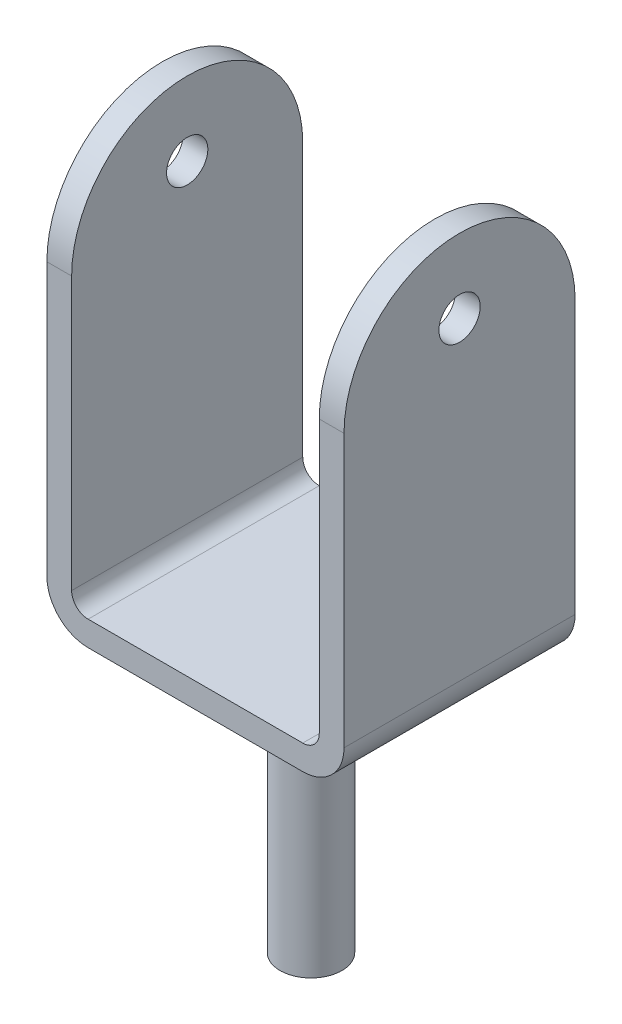
ISO-10303-21;
HEADER;
FILE_DESCRIPTION(('STEP AP214'),'2;1');
FILE_NAME('part.step','',(''),(''),'','','');
FILE_SCHEMA(('AUTOMOTIVE_DESIGN { 1 0 10303 214 1 1 1 1 }'));
ENDSEC;
DATA;
#1=APPLICATION_CONTEXT('core data for automotive mechanical design processes');
#2=APPLICATION_PROTOCOL_DEFINITION('international standard','automotive_design',2000,#1);
#3=PRODUCT_CONTEXT('',#1,'mechanical');
#4=PRODUCT('Part','Part','',(#3));
#5=PRODUCT_RELATED_PRODUCT_CATEGORY('part','',(#4));
#6=PRODUCT_DEFINITION_FORMATION('','',#4);
#7=PRODUCT_DEFINITION_CONTEXT('part definition',#1,'design');
#8=PRODUCT_DEFINITION('design','',#6,#7);
#9=PRODUCT_DEFINITION_SHAPE('','',#8);
#10=(LENGTH_UNIT() NAMED_UNIT(*) SI_UNIT(.MILLI.,.METRE.));
#11=(NAMED_UNIT(*) PLANE_ANGLE_UNIT() SI_UNIT($,.RADIAN.));
#12=(NAMED_UNIT(*) SI_UNIT($,.STERADIAN.) SOLID_ANGLE_UNIT());
#13=UNCERTAINTY_MEASURE_WITH_UNIT(LENGTH_MEASURE(1.E-05),#10,'distance_accuracy_value','');
#14=(GEOMETRIC_REPRESENTATION_CONTEXT(3) GLOBAL_UNCERTAINTY_ASSIGNED_CONTEXT((#13)) GLOBAL_UNIT_ASSIGNED_CONTEXT((#10,
#11,#12)) REPRESENTATION_CONTEXT('',''));
#15=CARTESIAN_POINT('',(0.,0.,0.));
#16=DIRECTION('',(0.,0.,1.));
#17=DIRECTION('',(1.,0.,0.));
#18=AXIS2_PLACEMENT_3D('',#15,#16,#17);
#19=CARTESIAN_POINT('',(-187.5,705.,0.));
#20=DIRECTION('',(1.,0.,0.));
#21=DIRECTION('',(0.,0.,-1.));
#22=AXIS2_PLACEMENT_3D('',#19,#20,#21);
#23=CYLINDRICAL_SURFACE('',#22,140.);
#24=DIRECTION('',(1.,0.,0.));
#25=VECTOR('',#24,1.);
#26=CARTESIAN_POINT('',(0.,705.,140.));
#27=LINE('',#26,#25);
#28=CARTESIAN_POINT('',(-187.5,705.,140.));
#29=VERTEX_POINT('',#28);
#30=CARTESIAN_POINT('',(-217.5,705.,140.));
#31=VERTEX_POINT('',#30);
#32=EDGE_CURVE('E222',#29,#31,#27,.F.);
#33=ORIENTED_EDGE('',*,*,#32,.F.);
#34=CARTESIAN_POINT('',(-187.5,705.,0.));
#35=DIRECTION('',(-1.,0.,0.));
#36=DIRECTION('',(0.,-1.,0.));
#37=AXIS2_PLACEMENT_3D('',#34,#35,#36);
#38=CIRCLE('',#37,140.);
#39=CARTESIAN_POINT('',(-187.5,705.,-140.));
#40=VERTEX_POINT('',#39);
#41=EDGE_CURVE('E45',#40,#29,#38,.F.);
#42=ORIENTED_EDGE('',*,*,#41,.F.);
#43=DIRECTION('',(-1.,0.,0.));
#44=VECTOR('',#43,1.);
#45=CARTESIAN_POINT('',(-187.5,705.,-140.));
#46=LINE('',#45,#44);
#47=CARTESIAN_POINT('',(-217.5,705.,-140.));
#48=VERTEX_POINT('',#47);
#49=EDGE_CURVE('E225',#48,#40,#46,.F.);
#50=ORIENTED_EDGE('',*,*,#49,.F.);
#51=CARTESIAN_POINT('',(-217.5,705.,0.));
#52=DIRECTION('',(-1.,0.,0.));
#53=DIRECTION('',(0.,-1.,0.));
#54=AXIS2_PLACEMENT_3D('',#51,#52,#53);
#55=CIRCLE('',#54,140.);
#56=EDGE_CURVE('E11',#31,#48,#55,.T.);
#57=ORIENTED_EDGE('',*,*,#56,.F.);
#58=EDGE_LOOP('',(#33,#42,#50,#57));
#59=FACE_BOUND('',#58,.T.);
#60=ADVANCED_FACE('F37',(#59),#23,.T.);
#61=CARTESIAN_POINT('',(142.5,705.,0.));
#62=DIRECTION('',(-1.,0.,0.));
#63=DIRECTION('',(0.,0.,1.));
#64=AXIS2_PLACEMENT_3D('',#61,#62,#63);
#65=CYLINDRICAL_SURFACE('',#64,140.);
#66=DIRECTION('',(1.,0.,0.));
#67=VECTOR('',#66,1.);
#68=CARTESIAN_POINT('',(142.5,705.,140.));
#69=LINE('',#68,#67);
#70=CARTESIAN_POINT('',(142.5,705.,140.));
#71=VERTEX_POINT('',#70);
#72=CARTESIAN_POINT('',(112.5,705.,140.));
#73=VERTEX_POINT('',#72);
#74=EDGE_CURVE('E150',#71,#73,#69,.F.);
#75=ORIENTED_EDGE('',*,*,#74,.F.);
#76=CARTESIAN_POINT('',(142.5,705.,0.));
#77=DIRECTION('',(-1.,0.,0.));
#78=DIRECTION('',(0.,-1.,0.));
#79=AXIS2_PLACEMENT_3D('',#76,#77,#78);
#80=CIRCLE('',#79,140.);
#81=CARTESIAN_POINT('',(142.5,705.,-140.));
#82=VERTEX_POINT('',#81);
#83=EDGE_CURVE('E218',#82,#71,#80,.F.);
#84=ORIENTED_EDGE('',*,*,#83,.F.);
#85=DIRECTION('',(-1.,0.,0.));
#86=VECTOR('',#85,1.);
#87=CARTESIAN_POINT('',(0.,705.,-140.));
#88=LINE('',#87,#86);
#89=CARTESIAN_POINT('',(112.5,705.,-140.));
#90=VERTEX_POINT('',#89);
#91=EDGE_CURVE('E215',#90,#82,#88,.F.);
#92=ORIENTED_EDGE('',*,*,#91,.F.);
#93=CARTESIAN_POINT('',(112.5,705.,0.));
#94=DIRECTION('',(-1.,0.,0.));
#95=DIRECTION('',(0.,-1.,0.));
#96=AXIS2_PLACEMENT_3D('',#93,#94,#95);
#97=CIRCLE('',#96,140.);
#98=EDGE_CURVE('E220',#73,#90,#97,.T.);
#99=ORIENTED_EDGE('',*,*,#98,.F.);
#100=EDGE_LOOP('',(#75,#84,#92,#99));
#101=FACE_BOUND('',#100,.T.);
#102=ADVANCED_FACE('F260',(#101),#65,.T.);
#103=CARTESIAN_POINT('',(112.5,0.,140.));
#104=DIRECTION('',(-1.,0.,0.));
#105=DIRECTION('',(0.,-1.,0.));
#106=AXIS2_PLACEMENT_3D('',#103,#104,#105);
#107=PLANE('',#106);
#108=CARTESIAN_POINT('',(112.5,755.572053683915,0.));
#109=DIRECTION('',(-1.,0.,0.));
#110=DIRECTION('',(0.,-1.,0.));
#111=AXIS2_PLACEMENT_3D('',#108,#109,#110);
#112=CIRCLE('',#111,25.);
#113=CARTESIAN_POINT('',(112.5,780.572053683915,0.));
#114=VERTEX_POINT('',#113);
#115=EDGE_CURVE('E289',#114,#114,#112,.T.);
#116=ORIENTED_EDGE('',*,*,#115,.F.);
#117=EDGE_LOOP('',(#116));
#118=FACE_BOUND('',#117,.T.);
#119=DIRECTION('',(0.,1.,0.));
#120=VECTOR('',#119,1.);
#121=CARTESIAN_POINT('',(112.5,0.,140.));
#122=LINE('',#121,#120);
#123=CARTESIAN_POINT('',(112.5,375.,140.));
#124=VERTEX_POINT('',#123);
#125=EDGE_CURVE('E128',#124,#73,#122,.T.);
#126=ORIENTED_EDGE('',*,*,#125,.T.);
#127=ORIENTED_EDGE('',*,*,#98,.T.);
#128=DIRECTION('',(0.,1.,0.));
#129=VECTOR('',#128,1.);
#130=CARTESIAN_POINT('',(112.5,0.,-140.));
#131=LINE('',#130,#129);
#132=CARTESIAN_POINT('',(112.5,375.,-140.));
#133=VERTEX_POINT('',#132);
#134=EDGE_CURVE('E130',#133,#90,#131,.T.);
#135=ORIENTED_EDGE('',*,*,#134,.F.);
#136=DIRECTION('',(0.,0.,-1.));
#137=VECTOR('',#136,1.);
#138=CARTESIAN_POINT('',(112.5,375.,140.));
#139=LINE('',#138,#137);
#140=EDGE_CURVE('E124',#124,#133,#139,.T.);
#141=ORIENTED_EDGE('',*,*,#140,.F.);
#142=EDGE_LOOP('',(#126,#127,#135,#141));
#143=FACE_BOUND('',#142,.T.);
#144=ADVANCED_FACE('F126',(#118,#143),#107,.T.);
#145=CARTESIAN_POINT('',(92.5,375.,140.));
#146=DIRECTION('',(0.,0.,-1.));
#147=DIRECTION('',(-1.,0.,0.));
#148=AXIS2_PLACEMENT_3D('',#145,#146,#147);
#149=CYLINDRICAL_SURFACE('',#148,20.);
#150=CARTESIAN_POINT('',(92.5,375.,-140.));
#151=DIRECTION('',(0.,0.,1.));
#152=DIRECTION('',(1.,0.,0.));
#153=AXIS2_PLACEMENT_3D('',#150,#151,#152);
#154=CIRCLE('',#153,20.);
#155=CARTESIAN_POINT('',(92.4999999999999,355.,-140.));
#156=VERTEX_POINT('',#155);
#157=EDGE_CURVE('E178',#133,#156,#154,.F.);
#158=ORIENTED_EDGE('',*,*,#157,.T.);
#159=DIRECTION('',(0.,0.,-1.));
#160=VECTOR('',#159,1.);
#161=CARTESIAN_POINT('',(92.4999999999999,355.,140.));
#162=LINE('',#161,#160);
#163=CARTESIAN_POINT('',(92.4999999999999,355.,140.));
#164=VERTEX_POINT('',#163);
#165=EDGE_CURVE('E135',#164,#156,#162,.T.);
#166=ORIENTED_EDGE('',*,*,#165,.F.);
#167=CARTESIAN_POINT('',(92.5,375.,140.));
#168=DIRECTION('',(0.,0.,1.));
#169=DIRECTION('',(1.,0.,0.));
#170=AXIS2_PLACEMENT_3D('',#167,#168,#169);
#171=CIRCLE('',#170,20.);
#172=EDGE_CURVE('E138',#124,#164,#171,.F.);
#173=ORIENTED_EDGE('',*,*,#172,.F.);
#174=ORIENTED_EDGE('',*,*,#140,.T.);
#175=EDGE_LOOP('',(#158,#166,#173,#174));
#176=FACE_BOUND('',#175,.T.);
#177=ADVANCED_FACE('F139',(#176),#149,.F.);
#178=CARTESIAN_POINT('',(0.,355.,140.));
#179=DIRECTION('',(0.,1.,0.));
#180=DIRECTION('',(-1.,0.,0.));
#181=AXIS2_PLACEMENT_3D('',#178,#179,#180);
#182=PLANE('',#181);
#183=DIRECTION('',(1.,0.,0.));
#184=VECTOR('',#183,1.);
#185=CARTESIAN_POINT('',(0.,355.,-140.));
#186=LINE('',#185,#184);
#187=CARTESIAN_POINT('',(-167.5,355.,-140.));
#188=VERTEX_POINT('',#187);
#189=EDGE_CURVE('E180',#188,#156,#186,.T.);
#190=ORIENTED_EDGE('',*,*,#189,.F.);
#191=DIRECTION('',(0.,0.,-1.));
#192=VECTOR('',#191,1.);
#193=CARTESIAN_POINT('',(-167.5,355.,140.));
#194=LINE('',#193,#192);
#195=CARTESIAN_POINT('',(-167.5,355.,140.));
#196=VERTEX_POINT('',#195);
#197=EDGE_CURVE('E209',#196,#188,#194,.T.);
#198=ORIENTED_EDGE('',*,*,#197,.F.);
#199=DIRECTION('',(1.,0.,0.));
#200=VECTOR('',#199,1.);
#201=CARTESIAN_POINT('',(0.,355.,140.));
#202=LINE('',#201,#200);
#203=EDGE_CURVE('E143',#196,#164,#202,.T.);
#204=ORIENTED_EDGE('',*,*,#203,.T.);
#205=ORIENTED_EDGE('',*,*,#165,.T.);
#206=EDGE_LOOP('',(#190,#198,#204,#205));
#207=FACE_BOUND('',#206,.T.);
#208=ADVANCED_FACE('F262',(#207),#182,.T.);
#209=CARTESIAN_POINT('',(-167.5,375.,140.));
#210=DIRECTION('',(0.,0.,-1.));
#211=DIRECTION('',(-1.,0.,0.));
#212=AXIS2_PLACEMENT_3D('',#209,#210,#211);
#213=CYLINDRICAL_SURFACE('',#212,20.);
#214=CARTESIAN_POINT('',(-167.5,375.,-140.));
#215=DIRECTION('',(0.,0.,1.));
#216=DIRECTION('',(1.,0.,0.));
#217=AXIS2_PLACEMENT_3D('',#214,#215,#216);
#218=CIRCLE('',#217,20.);
#219=CARTESIAN_POINT('',(-187.5,375.,-140.));
#220=VERTEX_POINT('',#219);
#221=EDGE_CURVE('E183',#188,#220,#218,.F.);
#222=ORIENTED_EDGE('',*,*,#221,.T.);
#223=DIRECTION('',(0.,0.,-1.));
#224=VECTOR('',#223,1.);
#225=CARTESIAN_POINT('',(-187.5,375.,140.));
#226=LINE('',#225,#224);
#227=CARTESIAN_POINT('',(-187.5,375.,140.));
#228=VERTEX_POINT('',#227);
#229=EDGE_CURVE('E206',#228,#220,#226,.T.);
#230=ORIENTED_EDGE('',*,*,#229,.F.);
#231=CARTESIAN_POINT('',(-167.5,375.,140.));
#232=DIRECTION('',(0.,0.,1.));
#233=DIRECTION('',(1.,0.,0.));
#234=AXIS2_PLACEMENT_3D('',#231,#232,#233);
#235=CIRCLE('',#234,20.);
#236=EDGE_CURVE('E161',#196,#228,#235,.F.);
#237=ORIENTED_EDGE('',*,*,#236,.F.);
#238=ORIENTED_EDGE('',*,*,#197,.T.);
#239=EDGE_LOOP('',(#222,#230,#237,#238));
#240=FACE_BOUND('',#239,.T.);
#241=ADVANCED_FACE('F234',(#240),#213,.F.);
#242=CARTESIAN_POINT('',(-187.5,0.,140.));
#243=DIRECTION('',(-1.,0.,0.));
#244=DIRECTION('',(0.,-1.,0.));
#245=AXIS2_PLACEMENT_3D('',#242,#243,#244);
#246=PLANE('',#245);
#247=CARTESIAN_POINT('',(-187.5,755.572053683915,0.));
#248=DIRECTION('',(-1.,0.,0.));
#249=DIRECTION('',(0.,-1.,0.));
#250=AXIS2_PLACEMENT_3D('',#247,#248,#249);
#251=CIRCLE('',#250,25.);
#252=CARTESIAN_POINT('',(-187.5,780.572053683915,0.));
#253=VERTEX_POINT('',#252);
#254=EDGE_CURVE('E291',#253,#253,#251,.T.);
#255=ORIENTED_EDGE('',*,*,#254,.T.);
#256=EDGE_LOOP('',(#255));
#257=FACE_BOUND('',#256,.T.);
#258=DIRECTION('',(0.,1.,0.));
#259=VECTOR('',#258,1.);
#260=CARTESIAN_POINT('',(-187.5,0.,-140.));
#261=LINE('',#260,#259);
#262=EDGE_CURVE('E185',#220,#40,#261,.T.);
#263=ORIENTED_EDGE('',*,*,#262,.T.);
#264=ORIENTED_EDGE('',*,*,#41,.T.);
#265=DIRECTION('',(0.,1.,0.));
#266=VECTOR('',#265,1.);
#267=CARTESIAN_POINT('',(-187.5,0.,140.));
#268=LINE('',#267,#266);
#269=EDGE_CURVE('E163',#228,#29,#268,.T.);
#270=ORIENTED_EDGE('',*,*,#269,.F.);
#271=ORIENTED_EDGE('',*,*,#229,.T.);
#272=EDGE_LOOP('',(#263,#264,#270,#271));
#273=FACE_BOUND('',#272,.T.);
#274=ADVANCED_FACE('F228',(#257,#273),#246,.F.);
#275=CARTESIAN_POINT('',(-217.5,0.,140.));
#276=DIRECTION('',(-1.,0.,0.));
#277=DIRECTION('',(0.,-1.,0.));
#278=AXIS2_PLACEMENT_3D('',#275,#276,#277);
#279=PLANE('',#278);
#280=CARTESIAN_POINT('',(-217.5,755.572053683915,0.));
#281=DIRECTION('',(1.,0.,0.));
#282=DIRECTION('',(0.,1.,0.));
#283=AXIS2_PLACEMENT_3D('',#280,#281,#282);
#284=CIRCLE('',#283,25.);
#285=CARTESIAN_POINT('',(-217.5,780.572053683915,0.));
#286=VERTEX_POINT('',#285);
#287=EDGE_CURVE('E294',#286,#286,#284,.T.);
#288=ORIENTED_EDGE('',*,*,#287,.T.);
#289=EDGE_LOOP('',(#288));
#290=FACE_BOUND('',#289,.T.);
#291=DIRECTION('',(0.,1.,0.));
#292=VECTOR('',#291,1.);
#293=CARTESIAN_POINT('',(-217.5,0.,140.));
#294=LINE('',#293,#292);
#295=CARTESIAN_POINT('',(-217.5,375.,140.));
#296=VERTEX_POINT('',#295);
#297=EDGE_CURVE('E165',#296,#31,#294,.T.);
#298=ORIENTED_EDGE('',*,*,#297,.T.);
#299=ORIENTED_EDGE('',*,*,#56,.T.);
#300=DIRECTION('',(0.,1.,0.));
#301=VECTOR('',#300,1.);
#302=CARTESIAN_POINT('',(-217.5,0.,-140.));
#303=LINE('',#302,#301);
#304=CARTESIAN_POINT('',(-217.5,375.,-140.));
#305=VERTEX_POINT('',#304);
#306=EDGE_CURVE('E188',#305,#48,#303,.T.);
#307=ORIENTED_EDGE('',*,*,#306,.F.);
#308=DIRECTION('',(0.,0.,-1.));
#309=VECTOR('',#308,1.);
#310=CARTESIAN_POINT('',(-217.5,375.,140.));
#311=LINE('',#310,#309);
#312=EDGE_CURVE('E204',#296,#305,#311,.T.);
#313=ORIENTED_EDGE('',*,*,#312,.F.);
#314=EDGE_LOOP('',(#298,#299,#307,#313));
#315=FACE_BOUND('',#314,.T.);
#316=ADVANCED_FACE('F241',(#290,#315),#279,.T.);
#317=CARTESIAN_POINT('',(-167.5,375.,140.));
#318=DIRECTION('',(0.,0.,-1.));
#319=DIRECTION('',(-1.,0.,0.));
#320=AXIS2_PLACEMENT_3D('',#317,#318,#319);
#321=CYLINDRICAL_SURFACE('',#320,50.);
#322=CARTESIAN_POINT('',(-167.5,375.,-140.));
#323=DIRECTION('',(0.,0.,1.));
#324=DIRECTION('',(1.,0.,0.));
#325=AXIS2_PLACEMENT_3D('',#322,#323,#324);
#326=CIRCLE('',#325,50.);
#327=CARTESIAN_POINT('',(-167.5,325.,-140.));
#328=VERTEX_POINT('',#327);
#329=EDGE_CURVE('E191',#328,#305,#326,.F.);
#330=ORIENTED_EDGE('',*,*,#329,.F.);
#331=DIRECTION('',(0.,0.,-1.));
#332=VECTOR('',#331,1.);
#333=CARTESIAN_POINT('',(-167.5,325.,140.));
#334=LINE('',#333,#332);
#335=CARTESIAN_POINT('',(-167.5,325.,140.));
#336=VERTEX_POINT('',#335);
#337=EDGE_CURVE('E202',#336,#328,#334,.T.);
#338=ORIENTED_EDGE('',*,*,#337,.F.);
#339=CARTESIAN_POINT('',(-167.5,375.,140.));
#340=DIRECTION('',(0.,0.,1.));
#341=DIRECTION('',(1.,0.,0.));
#342=AXIS2_PLACEMENT_3D('',#339,#340,#341);
#343=CIRCLE('',#342,50.);
#344=EDGE_CURVE('E167',#336,#296,#343,.F.);
#345=ORIENTED_EDGE('',*,*,#344,.T.);
#346=ORIENTED_EDGE('',*,*,#312,.T.);
#347=EDGE_LOOP('',(#330,#338,#345,#346));
#348=FACE_BOUND('',#347,.T.);
#349=ADVANCED_FACE('F244',(#348),#321,.T.);
#350=CARTESIAN_POINT('',(0.,325.,140.));
#351=DIRECTION('',(0.,1.,0.));
#352=DIRECTION('',(-1.,0.,0.));
#353=AXIS2_PLACEMENT_3D('',#350,#351,#352);
#354=PLANE('',#353);
#355=CARTESIAN_POINT('',(-37.5,325.,0.));
#356=DIRECTION('',(0.,1.,0.));
#357=DIRECTION('',(-1.,0.,0.));
#358=AXIS2_PLACEMENT_3D('',#355,#356,#357);
#359=CIRCLE('',#358,37.5);
#360=CARTESIAN_POINT('',(-75.,325.,0.));
#361=VERTEX_POINT('',#360);
#362=EDGE_CURVE('E134',#361,#361,#359,.F.);
#363=ORIENTED_EDGE('',*,*,#362,.F.);
#364=EDGE_LOOP('',(#363));
#365=FACE_BOUND('',#364,.T.);
#366=DIRECTION('',(1.,0.,0.));
#367=VECTOR('',#366,1.);
#368=CARTESIAN_POINT('',(0.,325.,-140.));
#369=LINE('',#368,#367);
#370=CARTESIAN_POINT('',(92.5,325.,-140.));
#371=VERTEX_POINT('',#370);
#372=EDGE_CURVE('E194',#328,#371,#369,.T.);
#373=ORIENTED_EDGE('',*,*,#372,.T.);
#374=DIRECTION('',(0.,0.,-1.));
#375=VECTOR('',#374,1.);
#376=CARTESIAN_POINT('',(92.5,325.,140.));
#377=LINE('',#376,#375);
#378=CARTESIAN_POINT('',(92.5,325.,140.));
#379=VERTEX_POINT('',#378);
#380=EDGE_CURVE('E199',#379,#371,#377,.T.);
#381=ORIENTED_EDGE('',*,*,#380,.F.);
#382=DIRECTION('',(1.,0.,0.));
#383=VECTOR('',#382,1.);
#384=CARTESIAN_POINT('',(0.,325.,140.));
#385=LINE('',#384,#383);
#386=EDGE_CURVE('E170',#336,#379,#385,.T.);
#387=ORIENTED_EDGE('',*,*,#386,.F.);
#388=ORIENTED_EDGE('',*,*,#337,.T.);
#389=EDGE_LOOP('',(#373,#381,#387,#388));
#390=FACE_BOUND('',#389,.T.);
#391=ADVANCED_FACE('F248',(#365,#390),#354,.F.);
#392=CARTESIAN_POINT('',(92.5,375.,140.));
#393=DIRECTION('',(0.,0.,-1.));
#394=DIRECTION('',(-1.,0.,0.));
#395=AXIS2_PLACEMENT_3D('',#392,#393,#394);
#396=CYLINDRICAL_SURFACE('',#395,50.);
#397=CARTESIAN_POINT('',(92.5,375.,-140.));
#398=DIRECTION('',(0.,0.,1.));
#399=DIRECTION('',(1.,0.,0.));
#400=AXIS2_PLACEMENT_3D('',#397,#398,#399);
#401=CIRCLE('',#400,50.);
#402=CARTESIAN_POINT('',(142.5,375.,-140.));
#403=VERTEX_POINT('',#402);
#404=EDGE_CURVE('E154',#371,#403,#401,.T.);
#405=ORIENTED_EDGE('',*,*,#404,.T.);
#406=DIRECTION('',(0.,0.,-1.));
#407=VECTOR('',#406,1.);
#408=CARTESIAN_POINT('',(142.5,375.,140.));
#409=LINE('',#408,#407);
#410=CARTESIAN_POINT('',(142.5,375.,140.));
#411=VERTEX_POINT('',#410);
#412=EDGE_CURVE('E176',#411,#403,#409,.T.);
#413=ORIENTED_EDGE('',*,*,#412,.F.);
#414=CARTESIAN_POINT('',(92.5,375.,140.));
#415=DIRECTION('',(0.,0.,1.));
#416=DIRECTION('',(1.,0.,0.));
#417=AXIS2_PLACEMENT_3D('',#414,#415,#416);
#418=CIRCLE('',#417,50.);
#419=EDGE_CURVE('E172',#379,#411,#418,.T.);
#420=ORIENTED_EDGE('',*,*,#419,.F.);
#421=ORIENTED_EDGE('',*,*,#380,.T.);
#422=EDGE_LOOP('',(#405,#413,#420,#421));
#423=FACE_BOUND('',#422,.T.);
#424=ADVANCED_FACE('F253',(#423),#396,.T.);
#425=CARTESIAN_POINT('',(142.5,0.,140.));
#426=DIRECTION('',(-1.,0.,0.));
#427=DIRECTION('',(0.,-1.,0.));
#428=AXIS2_PLACEMENT_3D('',#425,#426,#427);
#429=PLANE('',#428);
#430=CARTESIAN_POINT('',(142.5,755.572053683915,0.));
#431=DIRECTION('',(1.,0.,0.));
#432=DIRECTION('',(0.,1.,0.));
#433=AXIS2_PLACEMENT_3D('',#430,#431,#432);
#434=CIRCLE('',#433,25.);
#435=CARTESIAN_POINT('',(142.5,780.572053683915,0.));
#436=VERTEX_POINT('',#435);
#437=EDGE_CURVE('E297',#436,#436,#434,.T.);
#438=ORIENTED_EDGE('',*,*,#437,.F.);
#439=EDGE_LOOP('',(#438));
#440=FACE_BOUND('',#439,.T.);
#441=DIRECTION('',(0.,1.,0.));
#442=VECTOR('',#441,1.);
#443=CARTESIAN_POINT('',(142.5,0.,-140.));
#444=LINE('',#443,#442);
#445=EDGE_CURVE('E151',#403,#82,#444,.T.);
#446=ORIENTED_EDGE('',*,*,#445,.T.);
#447=ORIENTED_EDGE('',*,*,#83,.T.);
#448=DIRECTION('',(0.,1.,0.));
#449=VECTOR('',#448,1.);
#450=CARTESIAN_POINT('',(142.5,0.,140.));
#451=LINE('',#450,#449);
#452=EDGE_CURVE('E174',#411,#71,#451,.T.);
#453=ORIENTED_EDGE('',*,*,#452,.F.);
#454=ORIENTED_EDGE('',*,*,#412,.T.);
#455=EDGE_LOOP('',(#446,#447,#453,#454));
#456=FACE_BOUND('',#455,.T.);
#457=ADVANCED_FACE('F257',(#440,#456),#429,.F.);
#458=CARTESIAN_POINT('',(0.,0.,140.));
#459=DIRECTION('',(0.,0.,1.));
#460=DIRECTION('',(1.,0.,0.));
#461=AXIS2_PLACEMENT_3D('',#458,#459,#460);
#462=PLANE('',#461);
#463=ORIENTED_EDGE('',*,*,#269,.T.);
#464=ORIENTED_EDGE('',*,*,#32,.T.);
#465=ORIENTED_EDGE('',*,*,#297,.F.);
#466=ORIENTED_EDGE('',*,*,#344,.F.);
#467=ORIENTED_EDGE('',*,*,#386,.T.);
#468=ORIENTED_EDGE('',*,*,#419,.T.);
#469=ORIENTED_EDGE('',*,*,#452,.T.);
#470=ORIENTED_EDGE('',*,*,#74,.T.);
#471=ORIENTED_EDGE('',*,*,#125,.F.);
#472=ORIENTED_EDGE('',*,*,#172,.T.);
#473=ORIENTED_EDGE('',*,*,#203,.F.);
#474=ORIENTED_EDGE('',*,*,#236,.T.);
#475=EDGE_LOOP('',(#463,#464,#465,#466,#467,#468,#469,#470,#471,#472,#473,#474));
#476=FACE_BOUND('',#475,.T.);
#477=ADVANCED_FACE('F147',(#476),#462,.T.);
#478=CARTESIAN_POINT('',(0.,0.,-140.));
#479=DIRECTION('',(0.,0.,1.));
#480=DIRECTION('',(1.,0.,0.));
#481=AXIS2_PLACEMENT_3D('',#478,#479,#480);
#482=PLANE('',#481);
#483=ORIENTED_EDGE('',*,*,#306,.T.);
#484=ORIENTED_EDGE('',*,*,#49,.T.);
#485=ORIENTED_EDGE('',*,*,#262,.F.);
#486=ORIENTED_EDGE('',*,*,#221,.F.);
#487=ORIENTED_EDGE('',*,*,#189,.T.);
#488=ORIENTED_EDGE('',*,*,#157,.F.);
#489=ORIENTED_EDGE('',*,*,#134,.T.);
#490=ORIENTED_EDGE('',*,*,#91,.T.);
#491=ORIENTED_EDGE('',*,*,#445,.F.);
#492=ORIENTED_EDGE('',*,*,#404,.F.);
#493=ORIENTED_EDGE('',*,*,#372,.F.);
#494=ORIENTED_EDGE('',*,*,#329,.T.);
#495=EDGE_LOOP('',(#483,#484,#485,#486,#487,#488,#489,#490,#491,#492,#493,#494));
#496=FACE_BOUND('',#495,.T.);
#497=ADVANCED_FACE('F237',(#496),#482,.F.);
#498=CARTESIAN_POINT('',(0.,0.,0.));
#499=DIRECTION('',(0.,-1.,0.));
#500=DIRECTION('',(1.,0.,0.));
#501=AXIS2_PLACEMENT_3D('',#498,#499,#500);
#502=PLANE('',#501);
#503=CARTESIAN_POINT('',(-37.5,0.,0.));
#504=DIRECTION('',(0.,1.,0.));
#505=DIRECTION('',(-1.,0.,0.));
#506=AXIS2_PLACEMENT_3D('',#503,#504,#505);
#507=CIRCLE('',#506,37.5);
#508=CARTESIAN_POINT('',(-75.,0.,0.));
#509=VERTEX_POINT('',#508);
#510=EDGE_CURVE('E157',#509,#509,#507,.T.);
#511=ORIENTED_EDGE('',*,*,#510,.F.);
#512=EDGE_LOOP('',(#511));
#513=FACE_BOUND('',#512,.T.);
#514=ADVANCED_FACE('F330',(#513),#502,.T.);
#515=CARTESIAN_POINT('',(-37.5,325.,0.));
#516=DIRECTION('',(0.,1.,0.));
#517=DIRECTION('',(-1.,0.,0.));
#518=AXIS2_PLACEMENT_3D('',#515,#516,#517);
#519=CYLINDRICAL_SURFACE('',#518,37.5);
#520=ORIENTED_EDGE('',*,*,#362,.T.);
#521=EDGE_LOOP('',(#520));
#522=FACE_BOUND('',#521,.T.);
#523=ORIENTED_EDGE('',*,*,#510,.T.);
#524=EDGE_LOOP('',(#523));
#525=FACE_BOUND('',#524,.T.);
#526=ADVANCED_FACE('F335',(#522,#525),#519,.T.);
#527=CARTESIAN_POINT('',(-217.5,755.572053683915,0.));
#528=DIRECTION('',(1.,0.,0.));
#529=DIRECTION('',(0.,1.,0.));
#530=AXIS2_PLACEMENT_3D('',#527,#528,#529);
#531=CYLINDRICAL_SURFACE('',#530,25.);
#532=CARTESIAN_POINT('',(112.5,780.572053683915,0.));
#533=CARTESIAN_POINT('',(112.8125,780.572053683915,0.));
#534=CARTESIAN_POINT('',(113.125,780.572053683915,0.));
#535=CARTESIAN_POINT('',(113.75,780.572053683915,0.));
#536=CARTESIAN_POINT('',(114.0625,780.572053683915,0.));
#537=CARTESIAN_POINT('',(114.6875,780.572053683915,0.));
#538=CARTESIAN_POINT('',(115.,780.572053683915,0.));
#539=CARTESIAN_POINT('',(115.625,780.572053683915,0.));
#540=CARTESIAN_POINT('',(115.9375,780.572053683915,0.));
#541=CARTESIAN_POINT('',(116.5625,780.572053683915,0.));
#542=CARTESIAN_POINT('',(116.875,780.572053683915,0.));
#543=CARTESIAN_POINT('',(117.5,780.572053683915,0.));
#544=CARTESIAN_POINT('',(117.8125,780.572053683915,0.));
#545=CARTESIAN_POINT('',(118.4375,780.572053683915,0.));
#546=CARTESIAN_POINT('',(118.75,780.572053683915,0.));
#547=CARTESIAN_POINT('',(119.375,780.572053683915,0.));
#548=CARTESIAN_POINT('',(119.6875,780.572053683915,0.));
#549=CARTESIAN_POINT('',(120.3125,780.572053683915,0.));
#550=CARTESIAN_POINT('',(120.625,780.572053683915,0.));
#551=CARTESIAN_POINT('',(121.25,780.572053683915,0.));
#552=CARTESIAN_POINT('',(121.5625,780.572053683915,0.));
#553=CARTESIAN_POINT('',(122.1875,780.572053683915,0.));
#554=CARTESIAN_POINT('',(122.5,780.572053683915,0.));
#555=CARTESIAN_POINT('',(123.125,780.572053683915,0.));
#556=CARTESIAN_POINT('',(123.4375,780.572053683915,0.));
#557=CARTESIAN_POINT('',(124.0625,780.572053683915,0.));
#558=CARTESIAN_POINT('',(124.375,780.572053683915,0.));
#559=CARTESIAN_POINT('',(125.,780.572053683915,0.));
#560=CARTESIAN_POINT('',(125.3125,780.572053683915,0.));
#561=CARTESIAN_POINT('',(125.9375,780.572053683915,0.));
#562=CARTESIAN_POINT('',(126.25,780.572053683915,0.));
#563=CARTESIAN_POINT('',(126.875,780.572053683915,0.));
#564=CARTESIAN_POINT('',(127.1875,780.572053683915,0.));
#565=CARTESIAN_POINT('',(127.8125,780.572053683915,0.));
#566=CARTESIAN_POINT('',(128.125,780.572053683915,0.));
#567=CARTESIAN_POINT('',(128.75,780.572053683915,0.));
#568=CARTESIAN_POINT('',(129.0625,780.572053683915,0.));
#569=CARTESIAN_POINT('',(129.6875,780.572053683915,0.));
#570=CARTESIAN_POINT('',(130.,780.572053683915,0.));
#571=CARTESIAN_POINT('',(130.625,780.572053683915,0.));
#572=CARTESIAN_POINT('',(130.9375,780.572053683915,0.));
#573=CARTESIAN_POINT('',(131.5625,780.572053683915,0.));
#574=CARTESIAN_POINT('',(131.875,780.572053683915,0.));
#575=CARTESIAN_POINT('',(132.5,780.572053683915,0.));
#576=CARTESIAN_POINT('',(132.8125,780.572053683915,0.));
#577=CARTESIAN_POINT('',(133.4375,780.572053683915,0.));
#578=CARTESIAN_POINT('',(133.75,780.572053683915,0.));
#579=CARTESIAN_POINT('',(134.375,780.572053683915,0.));
#580=CARTESIAN_POINT('',(134.6875,780.572053683915,0.));
#581=CARTESIAN_POINT('',(135.3125,780.572053683915,0.));
#582=CARTESIAN_POINT('',(135.625,780.572053683915,0.));
#583=CARTESIAN_POINT('',(136.25,780.572053683915,0.));
#584=CARTESIAN_POINT('',(136.5625,780.572053683915,0.));
#585=CARTESIAN_POINT('',(137.1875,780.572053683915,0.));
#586=CARTESIAN_POINT('',(137.5,780.572053683915,0.));
#587=CARTESIAN_POINT('',(138.125,780.572053683915,0.));
#588=CARTESIAN_POINT('',(138.4375,780.572053683915,0.));
#589=CARTESIAN_POINT('',(139.0625,780.572053683915,0.));
#590=CARTESIAN_POINT('',(139.375,780.572053683915,0.));
#591=CARTESIAN_POINT('',(140.,780.572053683915,0.));
#592=CARTESIAN_POINT('',(140.3125,780.572053683915,0.));
#593=CARTESIAN_POINT('',(140.9375,780.572053683915,0.));
#594=CARTESIAN_POINT('',(141.25,780.572053683915,0.));
#595=CARTESIAN_POINT('',(141.875,780.572053683915,0.));
#596=CARTESIAN_POINT('',(142.1875,780.572053683915,0.));
#597=CARTESIAN_POINT('',(142.5,780.572053683915,0.));
#598=B_SPLINE_CURVE_WITH_KNOTS('',3,(#532,#533,#534,#535,#536,#537,#538,#539,#540,#541,#542,
#543,#544,#545,#546,#547,#548,#549,#550,#551,#552,#553,#554,#555,#556,#557,#558,#559,#560,#561,
#562,#563,#564,#565,#566,#567,#568,#569,#570,#571,#572,#573,#574,#575,#576,#577,#578,#579,#580,
#581,#582,#583,#584,#585,#586,#587,#588,#589,#590,#591,#592,#593,#594,#595,#596,#597),
.UNSPECIFIED.,.F.,.F.,(4,2,2,2,2,2,2,2,2,2,2,2,2,2,2,2,2,2,2,2,2,2,2,2,2,2,2,2,2,2,2,2,4),(0.,
0.93749999999998,1.87500000000002,2.8125,3.74999999999998,4.68750000000001,5.62499999999999,
6.56249999999997,7.49999999999995,8.43749999999999,9.37499999999997,10.3124999999999,11.25,
12.1875,13.1249999999999,14.0625,15.,15.9374999999999,16.875,17.8125,18.7499999999999,19.6875,
20.625,21.5624999999999,22.5,23.4374999999999,24.3749999999999,25.3124999999999,
26.2499999999999,27.1874999999999,28.1249999999999,29.0624999999999,29.9999999999999),.UNSPECIFIED.);
#599=EDGE_CURVE('BSEAM307',#114,#436,#598,.T.);
#600=ORIENTED_EDGE('',*,*,#115,.T.);
#601=ORIENTED_EDGE('',*,*,#437,.T.);
#602=ORIENTED_EDGE('',*,*,#599,.T.);
#603=ORIENTED_EDGE('',*,*,#599,.F.);
#604=EDGE_LOOP('',(#600,#602,#601,#603));
#605=FACE_BOUND('',#604,.T.);
#606=ADVANCED_FACE('F307',(#605),#531,.F.);
#607=CARTESIAN_POINT('',(-217.5,780.572053683915,0.));
#608=CARTESIAN_POINT('',(-217.1875,780.572053683915,0.));
#609=CARTESIAN_POINT('',(-216.875,780.572053683915,0.));
#610=CARTESIAN_POINT('',(-216.25,780.572053683915,0.));
#611=CARTESIAN_POINT('',(-215.9375,780.572053683915,0.));
#612=CARTESIAN_POINT('',(-215.3125,780.572053683915,0.));
#613=CARTESIAN_POINT('',(-215.,780.572053683915,0.));
#614=CARTESIAN_POINT('',(-214.375,780.572053683915,0.));
#615=CARTESIAN_POINT('',(-214.0625,780.572053683915,0.));
#616=CARTESIAN_POINT('',(-213.4375,780.572053683915,0.));
#617=CARTESIAN_POINT('',(-213.125,780.572053683915,0.));
#618=CARTESIAN_POINT('',(-212.5,780.572053683915,0.));
#619=CARTESIAN_POINT('',(-212.1875,780.572053683915,0.));
#620=CARTESIAN_POINT('',(-211.5625,780.572053683915,0.));
#621=CARTESIAN_POINT('',(-211.25,780.572053683915,0.));
#622=CARTESIAN_POINT('',(-210.625,780.572053683915,0.));
#623=CARTESIAN_POINT('',(-210.3125,780.572053683915,0.));
#624=CARTESIAN_POINT('',(-209.6875,780.572053683915,0.));
#625=CARTESIAN_POINT('',(-209.375,780.572053683915,0.));
#626=CARTESIAN_POINT('',(-208.75,780.572053683915,0.));
#627=CARTESIAN_POINT('',(-208.4375,780.572053683915,0.));
#628=CARTESIAN_POINT('',(-207.8125,780.572053683915,0.));
#629=CARTESIAN_POINT('',(-207.5,780.572053683915,0.));
#630=CARTESIAN_POINT('',(-206.875,780.572053683915,0.));
#631=CARTESIAN_POINT('',(-206.5625,780.572053683915,0.));
#632=CARTESIAN_POINT('',(-205.9375,780.572053683915,0.));
#633=CARTESIAN_POINT('',(-205.625,780.572053683915,0.));
#634=CARTESIAN_POINT('',(-205.,780.572053683915,0.));
#635=CARTESIAN_POINT('',(-204.6875,780.572053683915,0.));
#636=CARTESIAN_POINT('',(-204.0625,780.572053683915,0.));
#637=CARTESIAN_POINT('',(-203.75,780.572053683915,0.));
#638=CARTESIAN_POINT('',(-203.125,780.572053683915,0.));
#639=CARTESIAN_POINT('',(-202.8125,780.572053683915,0.));
#640=CARTESIAN_POINT('',(-202.1875,780.572053683915,0.));
#641=CARTESIAN_POINT('',(-201.875,780.572053683915,0.));
#642=CARTESIAN_POINT('',(-201.25,780.572053683915,0.));
#643=CARTESIAN_POINT('',(-200.9375,780.572053683915,0.));
#644=CARTESIAN_POINT('',(-200.3125,780.572053683915,0.));
#645=CARTESIAN_POINT('',(-200.,780.572053683915,0.));
#646=CARTESIAN_POINT('',(-199.375,780.572053683915,0.));
#647=CARTESIAN_POINT('',(-199.0625,780.572053683915,0.));
#648=CARTESIAN_POINT('',(-198.4375,780.572053683915,0.));
#649=CARTESIAN_POINT('',(-198.125,780.572053683915,0.));
#650=CARTESIAN_POINT('',(-197.5,780.572053683915,0.));
#651=CARTESIAN_POINT('',(-197.1875,780.572053683915,0.));
#652=CARTESIAN_POINT('',(-196.5625,780.572053683915,0.));
#653=CARTESIAN_POINT('',(-196.25,780.572053683915,0.));
#654=CARTESIAN_POINT('',(-195.625,780.572053683915,0.));
#655=CARTESIAN_POINT('',(-195.3125,780.572053683915,0.));
#656=CARTESIAN_POINT('',(-194.6875,780.572053683915,0.));
#657=CARTESIAN_POINT('',(-194.375,780.572053683915,0.));
#658=CARTESIAN_POINT('',(-193.75,780.572053683915,0.));
#659=CARTESIAN_POINT('',(-193.4375,780.572053683915,0.));
#660=CARTESIAN_POINT('',(-192.8125,780.572053683915,0.));
#661=CARTESIAN_POINT('',(-192.5,780.572053683915,0.));
#662=CARTESIAN_POINT('',(-191.875,780.572053683915,0.));
#663=CARTESIAN_POINT('',(-191.5625,780.572053683915,0.));
#664=CARTESIAN_POINT('',(-190.9375,780.572053683915,0.));
#665=CARTESIAN_POINT('',(-190.625,780.572053683915,0.));
#666=CARTESIAN_POINT('',(-190.,780.572053683915,0.));
#667=CARTESIAN_POINT('',(-189.6875,780.572053683915,0.));
#668=CARTESIAN_POINT('',(-189.0625,780.572053683915,0.));
#669=CARTESIAN_POINT('',(-188.75,780.572053683915,0.));
#670=CARTESIAN_POINT('',(-188.125,780.572053683915,0.));
#671=CARTESIAN_POINT('',(-187.8125,780.572053683915,0.));
#672=CARTESIAN_POINT('',(-187.5,780.572053683915,0.));
#673=B_SPLINE_CURVE_WITH_KNOTS('',3,(#607,#608,#609,#610,#611,#612,#613,#614,#615,#616,#617,
#618,#619,#620,#621,#622,#623,#624,#625,#626,#627,#628,#629,#630,#631,#632,#633,#634,#635,#636,
#637,#638,#639,#640,#641,#642,#643,#644,#645,#646,#647,#648,#649,#650,#651,#652,#653,#654,#655,
#656,#657,#658,#659,#660,#661,#662,#663,#664,#665,#666,#667,#668,#669,#670,#671,#672),
.UNSPECIFIED.,.F.,.F.,(4,2,2,2,2,2,2,2,2,2,2,2,2,2,2,2,2,2,2,2,2,2,2,2,2,2,2,2,2,2,2,2,4),(0.,
0.937500000000008,1.87500000000002,2.81250000000002,3.75000000000003,4.68750000000004,
5.62500000000005,6.56250000000005,7.50000000000003,8.43750000000004,9.37500000000005,
10.3125000000001,11.2500000000001,12.1875000000001,13.1250000000001,14.0625000000001,
15.0000000000001,15.9375000000001,16.8750000000001,17.8125000000001,18.7500000000001,
19.6875000000001,20.6250000000001,21.5625000000001,22.5000000000001,23.4375000000001,
24.3750000000001,25.3125000000001,26.2500000000001,27.1875000000001,28.1250000000001,
29.0625000000001,30.0000000000001),.UNSPECIFIED.);
#674=EDGE_CURVE('BSEAM304',#286,#253,#673,.T.);
#675=ORIENTED_EDGE('',*,*,#287,.F.);
#676=ORIENTED_EDGE('',*,*,#254,.F.);
#677=ORIENTED_EDGE('',*,*,#674,.T.);
#678=ORIENTED_EDGE('',*,*,#674,.F.);
#679=EDGE_LOOP('',(#675,#677,#676,#678));
#680=FACE_BOUND('',#679,.T.);
#681=ADVANCED_FACE('F304',(#680),#531,.F.);
#682=CLOSED_SHELL('',(#60,#102,#144,#177,#208,#241,#274,#316,#349,#391,#424,#457,#477,#497,#514,
#526,#606,#681));
#683=MANIFOLD_SOLID_BREP('B2',#682);
#684=ADVANCED_BREP_SHAPE_REPRESENTATION('',(#18,#683),#14);
#685=SHAPE_DEFINITION_REPRESENTATION(#9,#684);
ENDSEC;
END-ISO-10303-21;
